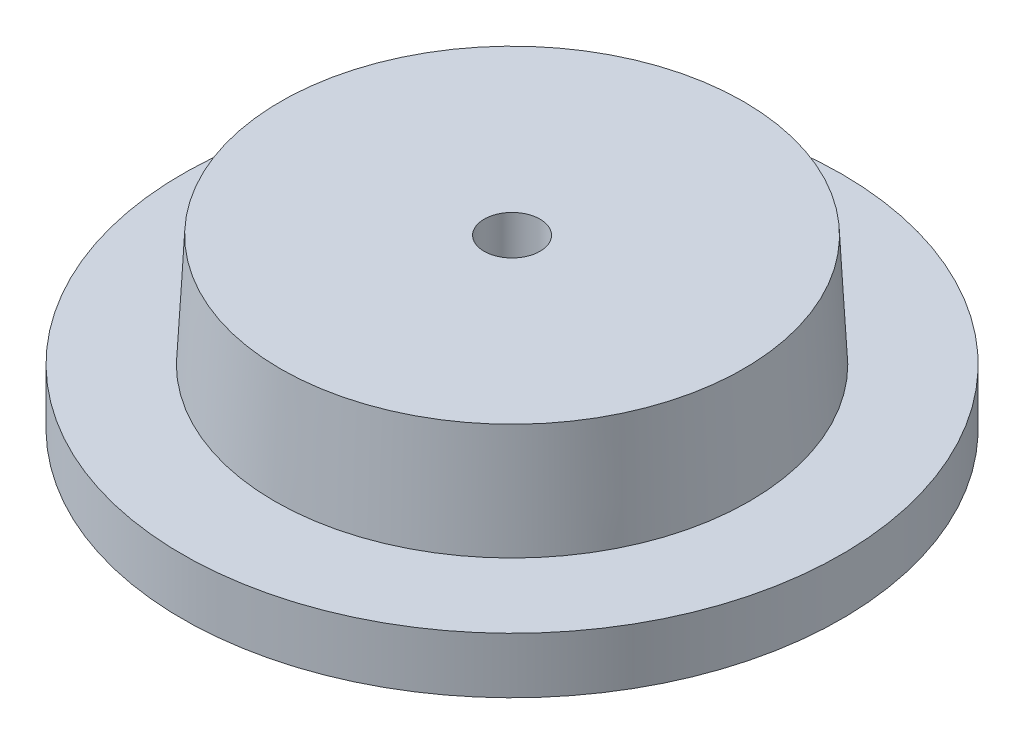
ISO-10303-21;
HEADER;
FILE_DESCRIPTION(('STEP AP214'),'2;1');
FILE_NAME('part.step','',(''),(''),'','','');
FILE_SCHEMA(('AUTOMOTIVE_DESIGN { 1 0 10303 214 1 1 1 1 }'));
ENDSEC;
DATA;
#1=APPLICATION_CONTEXT('core data for automotive mechanical design processes');
#2=APPLICATION_PROTOCOL_DEFINITION('international standard','automotive_design',2000,#1);
#3=PRODUCT_CONTEXT('',#1,'mechanical');
#4=PRODUCT('Part','Part','',(#3));
#5=PRODUCT_RELATED_PRODUCT_CATEGORY('part','',(#4));
#6=PRODUCT_DEFINITION_FORMATION('','',#4);
#7=PRODUCT_DEFINITION_CONTEXT('part definition',#1,'design');
#8=PRODUCT_DEFINITION('design','',#6,#7);
#9=PRODUCT_DEFINITION_SHAPE('','',#8);
#10=(LENGTH_UNIT() NAMED_UNIT(*) SI_UNIT(.MILLI.,.METRE.));
#11=(NAMED_UNIT(*) PLANE_ANGLE_UNIT() SI_UNIT($,.RADIAN.));
#12=(NAMED_UNIT(*) SI_UNIT($,.STERADIAN.) SOLID_ANGLE_UNIT());
#13=UNCERTAINTY_MEASURE_WITH_UNIT(LENGTH_MEASURE(1.E-05),#10,'distance_accuracy_value','');
#14=(GEOMETRIC_REPRESENTATION_CONTEXT(3) GLOBAL_UNCERTAINTY_ASSIGNED_CONTEXT((#13)) GLOBAL_UNIT_ASSIGNED_CONTEXT((#10,
#11,#12)) REPRESENTATION_CONTEXT('',''));
#15=CARTESIAN_POINT('',(0.,0.,0.));
#16=DIRECTION('',(0.,0.,1.));
#17=DIRECTION('',(1.,0.,0.));
#18=AXIS2_PLACEMENT_3D('',#15,#16,#17);
#19=CARTESIAN_POINT('',(0.,0.,0.));
#20=DIRECTION('',(0.,-1.,0.));
#21=DIRECTION('',(0.,0.,1.));
#22=AXIS2_PLACEMENT_3D('',#19,#20,#21);
#23=CONICAL_SURFACE('',#22,2.125,0.05235987755983);
#24=CARTESIAN_POINT('',(0.,1.,0.));
#25=DIRECTION('',(0.,1.,0.));
#26=DIRECTION('',(0.,0.,1.));
#27=AXIS2_PLACEMENT_3D('',#24,#25,#26);
#28=CIRCLE('',#27,2.07259222071696);
#29=CARTESIAN_POINT('',(0.,1.,2.07259222071696));
#30=VERTEX_POINT('',#29);
#31=EDGE_CURVE('E10',#30,#30,#28,.T.);
#32=ORIENTED_EDGE('',*,*,#31,.F.);
#33=EDGE_LOOP('',(#32));
#34=FACE_BOUND('',#33,.T.);
#35=CARTESIAN_POINT('',(0.,0.,0.));
#36=DIRECTION('',(0.,-1.,0.));
#37=DIRECTION('',(0.,0.,-1.));
#38=AXIS2_PLACEMENT_3D('',#35,#36,#37);
#39=CIRCLE('',#38,2.125);
#40=CARTESIAN_POINT('',(0.,0.,-2.125));
#41=VERTEX_POINT('',#40);
#42=EDGE_CURVE('E37',#41,#41,#39,.T.);
#43=ORIENTED_EDGE('',*,*,#42,.F.);
#44=EDGE_LOOP('',(#43));
#45=FACE_BOUND('',#44,.T.);
#46=ADVANCED_FACE('F31',(#34,#45),#23,.T.);
#47=CARTESIAN_POINT('',(0.,1.,0.));
#48=DIRECTION('',(0.,1.,0.));
#49=DIRECTION('',(0.,0.,1.));
#50=AXIS2_PLACEMENT_3D('',#47,#48,#49);
#51=PLANE('',#50);
#52=CARTESIAN_POINT('',(0.,1.,0.));
#53=DIRECTION('',(0.,1.,0.));
#54=DIRECTION('',(0.,0.,1.));
#55=AXIS2_PLACEMENT_3D('',#52,#53,#54);
#56=CIRCLE('',#55,0.25);
#57=CARTESIAN_POINT('',(0.,1.,0.25));
#58=VERTEX_POINT('',#57);
#59=EDGE_CURVE('E51',#58,#58,#56,.T.);
#60=ORIENTED_EDGE('',*,*,#59,.F.);
#61=EDGE_LOOP('',(#60));
#62=FACE_BOUND('',#61,.T.);
#63=ORIENTED_EDGE('',*,*,#31,.T.);
#64=EDGE_LOOP('',(#63));
#65=FACE_BOUND('',#64,.T.);
#66=ADVANCED_FACE('F66',(#62,#65),#51,.T.);
#67=CARTESIAN_POINT('',(0.,0.,0.));
#68=DIRECTION('',(0.,-1.,0.));
#69=DIRECTION('',(0.,0.,-1.));
#70=AXIS2_PLACEMENT_3D('',#67,#68,#69);
#71=PLANE('',#70);
#72=CARTESIAN_POINT('',(0.,0.,0.));
#73=DIRECTION('',(0.,-1.,0.));
#74=DIRECTION('',(0.,0.,-1.));
#75=AXIS2_PLACEMENT_3D('',#72,#73,#74);
#76=CIRCLE('',#75,2.95);
#77=CARTESIAN_POINT('',(0.,0.,-2.95));
#78=VERTEX_POINT('',#77);
#79=EDGE_CURVE('E45',#78,#78,#76,.T.);
#80=ORIENTED_EDGE('',*,*,#79,.F.);
#81=EDGE_LOOP('',(#80));
#82=FACE_BOUND('',#81,.T.);
#83=ORIENTED_EDGE('',*,*,#42,.T.);
#84=EDGE_LOOP('',(#83));
#85=FACE_BOUND('',#84,.T.);
#86=ADVANCED_FACE('F68',(#82,#85),#71,.F.);
#87=CARTESIAN_POINT('',(0.,-0.5,0.));
#88=DIRECTION('',(0.,1.,0.));
#89=DIRECTION('',(0.,0.,1.));
#90=AXIS2_PLACEMENT_3D('',#87,#88,#89);
#91=CYLINDRICAL_SURFACE('',#90,2.95);
#92=CARTESIAN_POINT('',(0.,-0.5,0.));
#93=DIRECTION('',(0.,-1.,0.));
#94=DIRECTION('',(0.,0.,-1.));
#95=AXIS2_PLACEMENT_3D('',#92,#93,#94);
#96=CIRCLE('',#95,2.95);
#97=CARTESIAN_POINT('',(0.,-0.5,-2.95));
#98=VERTEX_POINT('',#97);
#99=EDGE_CURVE('E41',#98,#98,#96,.T.);
#100=ORIENTED_EDGE('',*,*,#99,.F.);
#101=EDGE_LOOP('',(#100));
#102=FACE_BOUND('',#101,.T.);
#103=ORIENTED_EDGE('',*,*,#79,.T.);
#104=EDGE_LOOP('',(#103));
#105=FACE_BOUND('',#104,.T.);
#106=ADVANCED_FACE('F74',(#102,#105),#91,.T.);
#107=CARTESIAN_POINT('',(0.,-0.5,0.));
#108=DIRECTION('',(0.,-1.,0.));
#109=DIRECTION('',(0.,0.,-1.));
#110=AXIS2_PLACEMENT_3D('',#107,#108,#109);
#111=PLANE('',#110);
#112=CARTESIAN_POINT('',(0.,-0.5,0.));
#113=DIRECTION('',(0.,1.,0.));
#114=DIRECTION('',(0.,0.,1.));
#115=AXIS2_PLACEMENT_3D('',#112,#113,#114);
#116=CIRCLE('',#115,0.25);
#117=CARTESIAN_POINT('',(0.,-0.5,0.25));
#118=VERTEX_POINT('',#117);
#119=EDGE_CURVE('E49',#118,#118,#116,.T.);
#120=ORIENTED_EDGE('',*,*,#119,.T.);
#121=EDGE_LOOP('',(#120));
#122=FACE_BOUND('',#121,.T.);
#123=ORIENTED_EDGE('',*,*,#99,.T.);
#124=EDGE_LOOP('',(#123));
#125=FACE_BOUND('',#124,.T.);
#126=ADVANCED_FACE('F57',(#122,#125),#111,.T.);
#127=CARTESIAN_POINT('',(0.,-0.5,0.));
#128=DIRECTION('',(0.,1.,0.));
#129=DIRECTION('',(0.,0.,1.));
#130=AXIS2_PLACEMENT_3D('',#127,#128,#129);
#131=CYLINDRICAL_SURFACE('',#130,0.25);
#132=ORIENTED_EDGE('',*,*,#119,.F.);
#133=EDGE_LOOP('',(#132));
#134=FACE_BOUND('',#133,.T.);
#135=ORIENTED_EDGE('',*,*,#59,.T.);
#136=EDGE_LOOP('',(#135));
#137=FACE_BOUND('',#136,.T.);
#138=ADVANCED_FACE('F60',(#134,#137),#131,.F.);
#139=CLOSED_SHELL('',(#46,#66,#86,#106,#126,#138));
#140=MANIFOLD_SOLID_BREP('B2',#139);
#141=ADVANCED_BREP_SHAPE_REPRESENTATION('',(#18,#140),#14);
#142=SHAPE_DEFINITION_REPRESENTATION(#9,#141);
ENDSEC;
END-ISO-10303-21;
